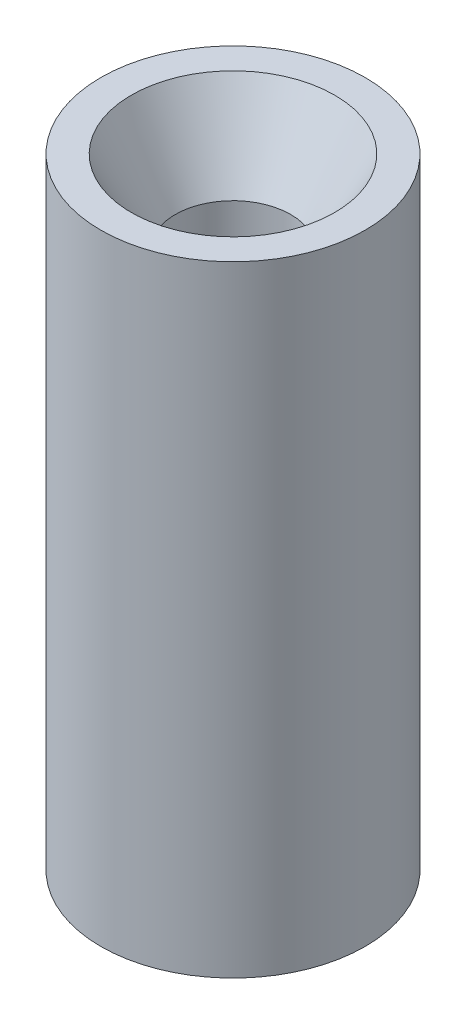
ISO-10303-21;
HEADER;
FILE_DESCRIPTION(('STEP AP214'),'2;1');
FILE_NAME('part.step','',(''),(''),'','','');
FILE_SCHEMA(('AUTOMOTIVE_DESIGN { 1 0 10303 214 1 1 1 1 }'));
ENDSEC;
DATA;
#1=APPLICATION_CONTEXT('core data for automotive mechanical design processes');
#2=APPLICATION_PROTOCOL_DEFINITION('international standard','automotive_design',2000,#1);
#3=PRODUCT_CONTEXT('',#1,'mechanical');
#4=PRODUCT('Part','Part','',(#3));
#5=PRODUCT_RELATED_PRODUCT_CATEGORY('part','',(#4));
#6=PRODUCT_DEFINITION_FORMATION('','',#4);
#7=PRODUCT_DEFINITION_CONTEXT('part definition',#1,'design');
#8=PRODUCT_DEFINITION('design','',#6,#7);
#9=PRODUCT_DEFINITION_SHAPE('','',#8);
#10=(LENGTH_UNIT() NAMED_UNIT(*) SI_UNIT(.MILLI.,.METRE.));
#11=(NAMED_UNIT(*) PLANE_ANGLE_UNIT() SI_UNIT($,.RADIAN.));
#12=(NAMED_UNIT(*) SI_UNIT($,.STERADIAN.) SOLID_ANGLE_UNIT());
#13=UNCERTAINTY_MEASURE_WITH_UNIT(LENGTH_MEASURE(1.E-05),#10,'distance_accuracy_value','');
#14=(GEOMETRIC_REPRESENTATION_CONTEXT(3) GLOBAL_UNCERTAINTY_ASSIGNED_CONTEXT((#13)) GLOBAL_UNIT_ASSIGNED_CONTEXT((#10,
#11,#12)) REPRESENTATION_CONTEXT('',''));
#15=CARTESIAN_POINT('',(0.,0.,0.));
#16=DIRECTION('',(0.,0.,1.));
#17=DIRECTION('',(1.,0.,0.));
#18=AXIS2_PLACEMENT_3D('',#15,#16,#17);
#19=CARTESIAN_POINT('',(-10.,61.,0.));
#20=DIRECTION('',(0.,-1.,0.));
#21=DIRECTION('',(0.,0.,-1.));
#22=AXIS2_PLACEMENT_3D('',#19,#20,#21);
#23=PLANE('',#22);
#24=CARTESIAN_POINT('',(0.,61.,0.));
#25=DIRECTION('',(0.,-1.,0.));
#26=DIRECTION('',(0.,0.,-1.));
#27=AXIS2_PLACEMENT_3D('',#24,#25,#26);
#28=CIRCLE('',#27,13.);
#29=CARTESIAN_POINT('',(0.,61.,-13.));
#30=VERTEX_POINT('',#29);
#31=EDGE_CURVE('E10',#30,#30,#28,.T.);
#32=ORIENTED_EDGE('',*,*,#31,.F.);
#33=EDGE_LOOP('',(#32));
#34=FACE_BOUND('',#33,.T.);
#35=CARTESIAN_POINT('',(0.,61.,0.));
#36=DIRECTION('',(0.,-1.,0.));
#37=DIRECTION('',(0.,0.,-1.));
#38=AXIS2_PLACEMENT_3D('',#35,#36,#37);
#39=CIRCLE('',#38,10.);
#40=CARTESIAN_POINT('',(0.,61.,-10.));
#41=VERTEX_POINT('',#40);
#42=EDGE_CURVE('E55',#41,#41,#39,.T.);
#43=ORIENTED_EDGE('',*,*,#42,.T.);
#44=EDGE_LOOP('',(#43));
#45=FACE_BOUND('',#44,.T.);
#46=ADVANCED_FACE('F33',(#34,#45),#23,.F.);
#47=CARTESIAN_POINT('',(0.,-23.5849336455897,0.));
#48=DIRECTION('',(0.,-1.,0.));
#49=DIRECTION('',(0.,0.,-1.));
#50=AXIS2_PLACEMENT_3D('',#47,#48,#49);
#51=CYLINDRICAL_SURFACE('',#50,13.);
#52=CARTESIAN_POINT('',(0.,0.,0.));
#53=DIRECTION('',(0.,-1.,0.));
#54=DIRECTION('',(0.,0.,-1.));
#55=AXIS2_PLACEMENT_3D('',#52,#53,#54);
#56=CIRCLE('',#55,13.);
#57=CARTESIAN_POINT('',(0.,0.,-13.));
#58=VERTEX_POINT('',#57);
#59=EDGE_CURVE('E39',#58,#58,#56,.T.);
#60=ORIENTED_EDGE('',*,*,#59,.F.);
#61=EDGE_LOOP('',(#60));
#62=FACE_BOUND('',#61,.T.);
#63=ORIENTED_EDGE('',*,*,#31,.T.);
#64=EDGE_LOOP('',(#63));
#65=FACE_BOUND('',#64,.T.);
#66=ADVANCED_FACE('F80',(#62,#65),#51,.T.);
#67=CARTESIAN_POINT('',(-13.,0.,0.));
#68=DIRECTION('',(0.,1.,0.));
#69=DIRECTION('',(0.,0.,1.));
#70=AXIS2_PLACEMENT_3D('',#67,#68,#69);
#71=PLANE('',#70);
#72=CARTESIAN_POINT('',(0.,0.,0.));
#73=DIRECTION('',(0.,-1.,0.));
#74=DIRECTION('',(0.,0.,-1.));
#75=AXIS2_PLACEMENT_3D('',#72,#73,#74);
#76=CIRCLE('',#75,9.99999999999999);
#77=CARTESIAN_POINT('',(0.,0.,-9.99999999999999));
#78=VERTEX_POINT('',#77);
#79=EDGE_CURVE('E43',#78,#78,#76,.T.);
#80=ORIENTED_EDGE('',*,*,#79,.F.);
#81=EDGE_LOOP('',(#80));
#82=FACE_BOUND('',#81,.T.);
#83=ORIENTED_EDGE('',*,*,#59,.T.);
#84=EDGE_LOOP('',(#83));
#85=FACE_BOUND('',#84,.T.);
#86=ADVANCED_FACE('F75',(#82,#85),#71,.F.);
#87=CARTESIAN_POINT('',(0.,0.,0.));
#88=DIRECTION('',(0.,-1.,0.));
#89=DIRECTION('',(0.,0.,-1.));
#90=AXIS2_PLACEMENT_3D('',#87,#88,#89);
#91=CONICAL_SURFACE('',#90,9.99999999999999,0.495617032962859);
#92=CARTESIAN_POINT('',(0.,8.,0.));
#93=DIRECTION('',(0.,-1.,0.));
#94=DIRECTION('',(0.,0.,-1.));
#95=AXIS2_PLACEMENT_3D('',#92,#93,#94);
#96=CIRCLE('',#95,5.675);
#97=CARTESIAN_POINT('',(0.,8.,-5.675));
#98=VERTEX_POINT('',#97);
#99=EDGE_CURVE('E47',#98,#98,#96,.T.);
#100=ORIENTED_EDGE('',*,*,#99,.F.);
#101=EDGE_LOOP('',(#100));
#102=FACE_BOUND('',#101,.T.);
#103=ORIENTED_EDGE('',*,*,#79,.T.);
#104=EDGE_LOOP('',(#103));
#105=FACE_BOUND('',#104,.T.);
#106=ADVANCED_FACE('F69',(#102,#105),#91,.F.);
#107=CARTESIAN_POINT('',(0.,-23.5849336455897,0.));
#108=DIRECTION('',(0.,-1.,0.));
#109=DIRECTION('',(0.,0.,-1.));
#110=AXIS2_PLACEMENT_3D('',#107,#108,#109);
#111=CYLINDRICAL_SURFACE('',#110,5.675);
#112=CARTESIAN_POINT('',(0.,53.,0.));
#113=DIRECTION('',(0.,-1.,0.));
#114=DIRECTION('',(0.,0.,-1.));
#115=AXIS2_PLACEMENT_3D('',#112,#113,#114);
#116=CIRCLE('',#115,5.675);
#117=CARTESIAN_POINT('',(0.,53.,-5.675));
#118=VERTEX_POINT('',#117);
#119=EDGE_CURVE('E52',#118,#118,#116,.T.);
#120=ORIENTED_EDGE('',*,*,#119,.F.);
#121=EDGE_LOOP('',(#120));
#122=FACE_BOUND('',#121,.T.);
#123=ORIENTED_EDGE('',*,*,#99,.T.);
#124=EDGE_LOOP('',(#123));
#125=FACE_BOUND('',#124,.T.);
#126=ADVANCED_FACE('F63',(#122,#125),#111,.F.);
#127=CARTESIAN_POINT('',(0.,53.,0.));
#128=DIRECTION('',(0.,1.,0.));
#129=DIRECTION('',(0.,0.,1.));
#130=AXIS2_PLACEMENT_3D('',#127,#128,#129);
#131=CONICAL_SURFACE('',#130,5.675,0.495617032962861);
#132=ORIENTED_EDGE('',*,*,#42,.F.);
#133=EDGE_LOOP('',(#132));
#134=FACE_BOUND('',#133,.T.);
#135=ORIENTED_EDGE('',*,*,#119,.T.);
#136=EDGE_LOOP('',(#135));
#137=FACE_BOUND('',#136,.T.);
#138=ADVANCED_FACE('F60',(#134,#137),#131,.F.);
#139=CLOSED_SHELL('',(#46,#66,#86,#106,#126,#138));
#140=MANIFOLD_SOLID_BREP('B2',#139);
#141=ADVANCED_BREP_SHAPE_REPRESENTATION('',(#18,#140),#14);
#142=SHAPE_DEFINITION_REPRESENTATION(#9,#141);
ENDSEC;
END-ISO-10303-21;
